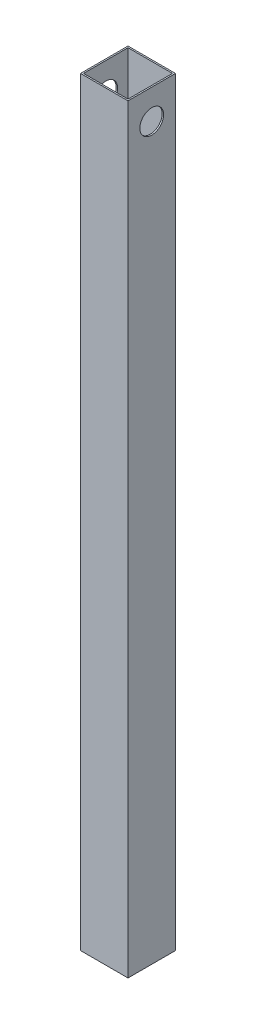
ISO-10303-21;
HEADER;
FILE_DESCRIPTION(('STEP AP214'),'2;1');
FILE_NAME('part.step','',(''),(''),'','','');
FILE_SCHEMA(('AUTOMOTIVE_DESIGN { 1 0 10303 214 1 1 1 1 }'));
ENDSEC;
DATA;
#1=APPLICATION_CONTEXT('core data for automotive mechanical design processes');
#2=APPLICATION_PROTOCOL_DEFINITION('international standard','automotive_design',2000,#1);
#3=PRODUCT_CONTEXT('',#1,'mechanical');
#4=PRODUCT('Part','Part','',(#3));
#5=PRODUCT_RELATED_PRODUCT_CATEGORY('part','',(#4));
#6=PRODUCT_DEFINITION_FORMATION('','',#4);
#7=PRODUCT_DEFINITION_CONTEXT('part definition',#1,'design');
#8=PRODUCT_DEFINITION('design','',#6,#7);
#9=PRODUCT_DEFINITION_SHAPE('','',#8);
#10=(LENGTH_UNIT() NAMED_UNIT(*) SI_UNIT(.MILLI.,.METRE.));
#11=(NAMED_UNIT(*) PLANE_ANGLE_UNIT() SI_UNIT($,.RADIAN.));
#12=(NAMED_UNIT(*) SI_UNIT($,.STERADIAN.) SOLID_ANGLE_UNIT());
#13=UNCERTAINTY_MEASURE_WITH_UNIT(LENGTH_MEASURE(1.E-05),#10,'distance_accuracy_value','');
#14=(GEOMETRIC_REPRESENTATION_CONTEXT(3) GLOBAL_UNCERTAINTY_ASSIGNED_CONTEXT((#13)) GLOBAL_UNIT_ASSIGNED_CONTEXT((#10,
#11,#12)) REPRESENTATION_CONTEXT('',''));
#15=CARTESIAN_POINT('',(0.,0.,0.));
#16=DIRECTION('',(0.,0.,1.));
#17=DIRECTION('',(1.,0.,0.));
#18=AXIS2_PLACEMENT_3D('',#15,#16,#17);
#19=CARTESIAN_POINT('',(0.,406.4,0.));
#20=DIRECTION('',(0.,-1.,0.));
#21=DIRECTION('',(0.,0.,-1.));
#22=AXIS2_PLACEMENT_3D('',#19,#20,#21);
#23=PLANE('',#22);
#24=DIRECTION('',(0.,0.,1.));
#25=VECTOR('',#24,1.);
#26=CARTESIAN_POINT('',(0.,406.4,0.));
#27=LINE('',#26,#25);
#28=CARTESIAN_POINT('',(0.,406.4,-50.8));
#29=VERTEX_POINT('',#28);
#30=CARTESIAN_POINT('',(0.,406.4,0.));
#31=VERTEX_POINT('',#30);
#32=EDGE_CURVE('E143',#29,#31,#27,.T.);
#33=ORIENTED_EDGE('',*,*,#32,.T.);
#34=DIRECTION('',(1.,0.,0.));
#35=VECTOR('',#34,1.);
#36=CARTESIAN_POINT('',(0.,406.4,0.));
#37=LINE('',#36,#35);
#38=CARTESIAN_POINT('',(50.8,406.4,0.));
#39=VERTEX_POINT('',#38);
#40=EDGE_CURVE('E146',#31,#39,#37,.T.);
#41=ORIENTED_EDGE('',*,*,#40,.T.);
#42=DIRECTION('',(0.,0.,-1.));
#43=VECTOR('',#42,1.);
#44=CARTESIAN_POINT('',(50.8,406.4,0.));
#45=LINE('',#44,#43);
#46=CARTESIAN_POINT('',(50.8,406.4,-50.8));
#47=VERTEX_POINT('',#46);
#48=EDGE_CURVE('E149',#39,#47,#45,.T.);
#49=ORIENTED_EDGE('',*,*,#48,.T.);
#50=DIRECTION('',(-1.,0.,0.));
#51=VECTOR('',#50,1.);
#52=CARTESIAN_POINT('',(0.,406.4,-50.8));
#53=LINE('',#52,#51);
#54=EDGE_CURVE('E150',#47,#29,#53,.T.);
#55=ORIENTED_EDGE('',*,*,#54,.T.);
#56=EDGE_LOOP('',(#33,#41,#49,#55));
#57=FACE_BOUND('',#56,.T.);
#58=DIRECTION('',(0.,0.,1.));
#59=VECTOR('',#58,1.);
#60=CARTESIAN_POINT('',(1.5875,406.4,0.));
#61=LINE('',#60,#59);
#62=CARTESIAN_POINT('',(1.5875,406.4,-49.2125));
#63=VERTEX_POINT('',#62);
#64=CARTESIAN_POINT('',(1.5875,406.4,-1.5875));
#65=VERTEX_POINT('',#64);
#66=EDGE_CURVE('E131',#63,#65,#61,.T.);
#67=ORIENTED_EDGE('',*,*,#66,.F.);
#68=DIRECTION('',(-1.,0.,0.));
#69=VECTOR('',#68,1.);
#70=CARTESIAN_POINT('',(0.,406.4,-49.2125));
#71=LINE('',#70,#69);
#72=CARTESIAN_POINT('',(49.2125,406.4,-49.2125));
#73=VERTEX_POINT('',#72);
#74=EDGE_CURVE('E115',#73,#63,#71,.T.);
#75=ORIENTED_EDGE('',*,*,#74,.F.);
#76=DIRECTION('',(0.,0.,-1.));
#77=VECTOR('',#76,1.);
#78=CARTESIAN_POINT('',(49.2125,406.4,0.));
#79=LINE('',#78,#77);
#80=CARTESIAN_POINT('',(49.2125,406.4,-1.5875));
#81=VERTEX_POINT('',#80);
#82=EDGE_CURVE('E140',#81,#73,#79,.T.);
#83=ORIENTED_EDGE('',*,*,#82,.F.);
#84=DIRECTION('',(1.,0.,0.));
#85=VECTOR('',#84,1.);
#86=CARTESIAN_POINT('',(0.,406.4,-1.5875));
#87=LINE('',#86,#85);
#88=EDGE_CURVE('E133',#65,#81,#87,.T.);
#89=ORIENTED_EDGE('',*,*,#88,.F.);
#90=EDGE_LOOP('',(#67,#75,#83,#89));
#91=FACE_BOUND('',#90,.T.);
#92=ADVANCED_FACE('F44',(#57,#91),#23,.F.);
#93=CARTESIAN_POINT('',(0.,-406.4,0.));
#94=DIRECTION('',(0.,-1.,0.));
#95=DIRECTION('',(0.,0.,-1.));
#96=AXIS2_PLACEMENT_3D('',#93,#94,#95);
#97=PLANE('',#96);
#98=DIRECTION('',(0.,0.,1.));
#99=VECTOR('',#98,1.);
#100=CARTESIAN_POINT('',(0.,-406.4,0.));
#101=LINE('',#100,#99);
#102=CARTESIAN_POINT('',(0.,-406.4,-50.8));
#103=VERTEX_POINT('',#102);
#104=CARTESIAN_POINT('',(0.,-406.4,0.));
#105=VERTEX_POINT('',#104);
#106=EDGE_CURVE('E154',#103,#105,#101,.T.);
#107=ORIENTED_EDGE('',*,*,#106,.F.);
#108=DIRECTION('',(-1.,0.,0.));
#109=VECTOR('',#108,1.);
#110=CARTESIAN_POINT('',(0.,-406.4,-50.8));
#111=LINE('',#110,#109);
#112=CARTESIAN_POINT('',(50.8,-406.4,-50.8));
#113=VERTEX_POINT('',#112);
#114=EDGE_CURVE('E147',#113,#103,#111,.T.);
#115=ORIENTED_EDGE('',*,*,#114,.F.);
#116=DIRECTION('',(0.,0.,-1.));
#117=VECTOR('',#116,1.);
#118=CARTESIAN_POINT('',(50.8,-406.4,0.));
#119=LINE('',#118,#117);
#120=CARTESIAN_POINT('',(50.8,-406.4,0.));
#121=VERTEX_POINT('',#120);
#122=EDGE_CURVE('E159',#121,#113,#119,.T.);
#123=ORIENTED_EDGE('',*,*,#122,.F.);
#124=DIRECTION('',(1.,0.,0.));
#125=VECTOR('',#124,1.);
#126=CARTESIAN_POINT('',(0.,-406.4,0.));
#127=LINE('',#126,#125);
#128=EDGE_CURVE('E157',#105,#121,#127,.T.);
#129=ORIENTED_EDGE('',*,*,#128,.F.);
#130=EDGE_LOOP('',(#107,#115,#123,#129));
#131=FACE_BOUND('',#130,.T.);
#132=DIRECTION('',(-1.,0.,0.));
#133=VECTOR('',#132,1.);
#134=CARTESIAN_POINT('',(0.,-406.4,-49.2125));
#135=LINE('',#134,#133);
#136=CARTESIAN_POINT('',(49.2125,-406.4,-49.2125));
#137=VERTEX_POINT('',#136);
#138=CARTESIAN_POINT('',(1.5875,-406.4,-49.2125));
#139=VERTEX_POINT('',#138);
#140=EDGE_CURVE('E113',#137,#139,#135,.T.);
#141=ORIENTED_EDGE('',*,*,#140,.T.);
#142=DIRECTION('',(0.,0.,1.));
#143=VECTOR('',#142,1.);
#144=CARTESIAN_POINT('',(1.5875,-406.4,0.));
#145=LINE('',#144,#143);
#146=CARTESIAN_POINT('',(1.5875,-406.4,-1.5875));
#147=VERTEX_POINT('',#146);
#148=EDGE_CURVE('E121',#139,#147,#145,.T.);
#149=ORIENTED_EDGE('',*,*,#148,.T.);
#150=DIRECTION('',(1.,0.,0.));
#151=VECTOR('',#150,1.);
#152=CARTESIAN_POINT('',(0.,-406.4,-1.5875));
#153=LINE('',#152,#151);
#154=CARTESIAN_POINT('',(49.2125,-406.4,-1.5875));
#155=VERTEX_POINT('',#154);
#156=EDGE_CURVE('E127',#147,#155,#153,.T.);
#157=ORIENTED_EDGE('',*,*,#156,.T.);
#158=DIRECTION('',(0.,0.,-1.));
#159=VECTOR('',#158,1.);
#160=CARTESIAN_POINT('',(49.2125,-406.4,0.));
#161=LINE('',#160,#159);
#162=EDGE_CURVE('E67',#155,#137,#161,.T.);
#163=ORIENTED_EDGE('',*,*,#162,.T.);
#164=EDGE_LOOP('',(#141,#149,#157,#163));
#165=FACE_BOUND('',#164,.T.);
#166=ADVANCED_FACE('F130',(#131,#165),#97,.T.);
#167=CARTESIAN_POINT('',(0.,406.4,0.));
#168=DIRECTION('',(1.,0.,0.));
#169=DIRECTION('',(0.,0.,-1.));
#170=AXIS2_PLACEMENT_3D('',#167,#168,#169);
#171=PLANE('',#170);
#172=CARTESIAN_POINT('',(0.,374.65,-25.4));
#173=DIRECTION('',(1.,0.,0.));
#174=DIRECTION('',(0.,0.,-1.));
#175=AXIS2_PLACEMENT_3D('',#172,#173,#174);
#176=CIRCLE('',#175,12.7);
#177=CARTESIAN_POINT('',(0.,374.65,-38.1));
#178=VERTEX_POINT('',#177);
#179=EDGE_CURVE('E232',#178,#178,#176,.T.);
#180=ORIENTED_EDGE('',*,*,#179,.T.);
#181=EDGE_LOOP('',(#180));
#182=FACE_BOUND('',#181,.T.);
#183=ORIENTED_EDGE('',*,*,#106,.T.);
#184=DIRECTION('',(0.,-1.,0.));
#185=VECTOR('',#184,1.);
#186=CARTESIAN_POINT('',(0.,406.4,0.));
#187=LINE('',#186,#185);
#188=EDGE_CURVE('E12',#31,#105,#187,.T.);
#189=ORIENTED_EDGE('',*,*,#188,.F.);
#190=ORIENTED_EDGE('',*,*,#32,.F.);
#191=DIRECTION('',(0.,-1.,0.));
#192=VECTOR('',#191,1.);
#193=CARTESIAN_POINT('',(0.,406.4,-50.8));
#194=LINE('',#193,#192);
#195=EDGE_CURVE('E153',#29,#103,#194,.T.);
#196=ORIENTED_EDGE('',*,*,#195,.T.);
#197=EDGE_LOOP('',(#183,#189,#190,#196));
#198=FACE_BOUND('',#197,.T.);
#199=ADVANCED_FACE('F46',(#182,#198),#171,.F.);
#200=CARTESIAN_POINT('',(0.,406.4,0.));
#201=DIRECTION('',(0.,0.,-1.));
#202=DIRECTION('',(-1.,0.,0.));
#203=AXIS2_PLACEMENT_3D('',#200,#201,#202);
#204=PLANE('',#203);
#205=ORIENTED_EDGE('',*,*,#128,.T.);
#206=DIRECTION('',(0.,-1.,0.));
#207=VECTOR('',#206,1.);
#208=CARTESIAN_POINT('',(50.8,406.4,0.));
#209=LINE('',#208,#207);
#210=EDGE_CURVE('E53',#39,#121,#209,.T.);
#211=ORIENTED_EDGE('',*,*,#210,.F.);
#212=ORIENTED_EDGE('',*,*,#40,.F.);
#213=ORIENTED_EDGE('',*,*,#188,.T.);
#214=EDGE_LOOP('',(#205,#211,#212,#213));
#215=FACE_BOUND('',#214,.T.);
#216=ADVANCED_FACE('F187',(#215),#204,.F.);
#217=CARTESIAN_POINT('',(50.8,406.4,0.));
#218=DIRECTION('',(-1.,0.,0.));
#219=DIRECTION('',(0.,0.,1.));
#220=AXIS2_PLACEMENT_3D('',#217,#218,#219);
#221=PLANE('',#220);
#222=CARTESIAN_POINT('',(50.8,374.65,-25.4));
#223=DIRECTION('',(1.,0.,0.));
#224=DIRECTION('',(0.,0.,-1.));
#225=AXIS2_PLACEMENT_3D('',#222,#223,#224);
#226=CIRCLE('',#225,12.7);
#227=CARTESIAN_POINT('',(50.8,374.65,-38.1));
#228=VERTEX_POINT('',#227);
#229=EDGE_CURVE('E236',#228,#228,#226,.T.);
#230=ORIENTED_EDGE('',*,*,#229,.F.);
#231=EDGE_LOOP('',(#230));
#232=FACE_BOUND('',#231,.T.);
#233=ORIENTED_EDGE('',*,*,#122,.T.);
#234=DIRECTION('',(0.,-1.,0.));
#235=VECTOR('',#234,1.);
#236=CARTESIAN_POINT('',(50.8,406.4,-50.8));
#237=LINE('',#236,#235);
#238=EDGE_CURVE('E164',#47,#113,#237,.T.);
#239=ORIENTED_EDGE('',*,*,#238,.F.);
#240=ORIENTED_EDGE('',*,*,#48,.F.);
#241=ORIENTED_EDGE('',*,*,#210,.T.);
#242=EDGE_LOOP('',(#233,#239,#240,#241));
#243=FACE_BOUND('',#242,.T.);
#244=ADVANCED_FACE('F172',(#232,#243),#221,.F.);
#245=CARTESIAN_POINT('',(0.,406.4,-50.8));
#246=DIRECTION('',(0.,0.,1.));
#247=DIRECTION('',(1.,0.,0.));
#248=AXIS2_PLACEMENT_3D('',#245,#246,#247);
#249=PLANE('',#248);
#250=ORIENTED_EDGE('',*,*,#114,.T.);
#251=ORIENTED_EDGE('',*,*,#195,.F.);
#252=ORIENTED_EDGE('',*,*,#54,.F.);
#253=ORIENTED_EDGE('',*,*,#238,.T.);
#254=EDGE_LOOP('',(#250,#251,#252,#253));
#255=FACE_BOUND('',#254,.T.);
#256=ADVANCED_FACE('F180',(#255),#249,.F.);
#257=CARTESIAN_POINT('',(1.5875,406.4,0.));
#258=DIRECTION('',(1.,0.,0.));
#259=DIRECTION('',(0.,0.,-1.));
#260=AXIS2_PLACEMENT_3D('',#257,#258,#259);
#261=PLANE('',#260);
#262=CARTESIAN_POINT('',(1.5875,374.65,-25.4));
#263=DIRECTION('',(1.,0.,0.));
#264=DIRECTION('',(0.,0.,-1.));
#265=AXIS2_PLACEMENT_3D('',#262,#263,#264);
#266=CIRCLE('',#265,12.7);
#267=CARTESIAN_POINT('',(1.5875,374.65,-38.1));
#268=VERTEX_POINT('',#267);
#269=EDGE_CURVE('E128',#268,#268,#266,.T.);
#270=ORIENTED_EDGE('',*,*,#269,.F.);
#271=EDGE_LOOP('',(#270));
#272=FACE_BOUND('',#271,.T.);
#273=ORIENTED_EDGE('',*,*,#148,.F.);
#274=DIRECTION('',(0.,-1.,0.));
#275=VECTOR('',#274,1.);
#276=CARTESIAN_POINT('',(1.5875,406.4,-49.2125));
#277=LINE('',#276,#275);
#278=EDGE_CURVE('E109',#63,#139,#277,.T.);
#279=ORIENTED_EDGE('',*,*,#278,.F.);
#280=ORIENTED_EDGE('',*,*,#66,.T.);
#281=DIRECTION('',(0.,-1.,0.));
#282=VECTOR('',#281,1.);
#283=CARTESIAN_POINT('',(1.5875,406.4,-1.5875));
#284=LINE('',#283,#282);
#285=EDGE_CURVE('E124',#65,#147,#284,.T.);
#286=ORIENTED_EDGE('',*,*,#285,.T.);
#287=EDGE_LOOP('',(#273,#279,#280,#286));
#288=FACE_BOUND('',#287,.T.);
#289=ADVANCED_FACE('F122',(#272,#288),#261,.T.);
#290=CARTESIAN_POINT('',(0.,406.4,-1.5875));
#291=DIRECTION('',(0.,0.,-1.));
#292=DIRECTION('',(-1.,0.,0.));
#293=AXIS2_PLACEMENT_3D('',#290,#291,#292);
#294=PLANE('',#293);
#295=ORIENTED_EDGE('',*,*,#156,.F.);
#296=ORIENTED_EDGE('',*,*,#285,.F.);
#297=ORIENTED_EDGE('',*,*,#88,.T.);
#298=DIRECTION('',(0.,-1.,0.));
#299=VECTOR('',#298,1.);
#300=CARTESIAN_POINT('',(49.2125,406.4,-1.5875));
#301=LINE('',#300,#299);
#302=EDGE_CURVE('E242',#81,#155,#301,.T.);
#303=ORIENTED_EDGE('',*,*,#302,.T.);
#304=EDGE_LOOP('',(#295,#296,#297,#303));
#305=FACE_BOUND('',#304,.T.);
#306=ADVANCED_FACE('F212',(#305),#294,.T.);
#307=CARTESIAN_POINT('',(49.2125,406.4,0.));
#308=DIRECTION('',(-1.,0.,0.));
#309=DIRECTION('',(0.,0.,1.));
#310=AXIS2_PLACEMENT_3D('',#307,#308,#309);
#311=PLANE('',#310);
#312=CARTESIAN_POINT('',(49.2125,374.65,-25.4));
#313=DIRECTION('',(-1.,0.,0.));
#314=DIRECTION('',(0.,0.,1.));
#315=AXIS2_PLACEMENT_3D('',#312,#313,#314);
#316=CIRCLE('',#315,12.7);
#317=CARTESIAN_POINT('',(49.2125,374.65,-12.7));
#318=VERTEX_POINT('',#317);
#319=EDGE_CURVE('E48',#318,#318,#316,.T.);
#320=ORIENTED_EDGE('',*,*,#319,.F.);
#321=EDGE_LOOP('',(#320));
#322=FACE_BOUND('',#321,.T.);
#323=ORIENTED_EDGE('',*,*,#162,.F.);
#324=ORIENTED_EDGE('',*,*,#302,.F.);
#325=ORIENTED_EDGE('',*,*,#82,.T.);
#326=DIRECTION('',(0.,-1.,0.));
#327=VECTOR('',#326,1.);
#328=CARTESIAN_POINT('',(49.2125,406.4,-49.2125));
#329=LINE('',#328,#327);
#330=EDGE_CURVE('E60',#73,#137,#329,.T.);
#331=ORIENTED_EDGE('',*,*,#330,.T.);
#332=EDGE_LOOP('',(#323,#324,#325,#331));
#333=FACE_BOUND('',#332,.T.);
#334=ADVANCED_FACE('F218',(#322,#333),#311,.T.);
#335=CARTESIAN_POINT('',(0.,406.4,-49.2125));
#336=DIRECTION('',(0.,0.,1.));
#337=DIRECTION('',(1.,0.,0.));
#338=AXIS2_PLACEMENT_3D('',#335,#336,#337);
#339=PLANE('',#338);
#340=ORIENTED_EDGE('',*,*,#140,.F.);
#341=ORIENTED_EDGE('',*,*,#330,.F.);
#342=ORIENTED_EDGE('',*,*,#74,.T.);
#343=ORIENTED_EDGE('',*,*,#278,.T.);
#344=EDGE_LOOP('',(#340,#341,#342,#343));
#345=FACE_BOUND('',#344,.T.);
#346=ADVANCED_FACE('F111',(#345),#339,.T.);
#347=CARTESIAN_POINT('',(0.,374.65,-25.4));
#348=DIRECTION('',(1.,0.,0.));
#349=DIRECTION('',(0.,0.,-1.));
#350=AXIS2_PLACEMENT_3D('',#347,#348,#349);
#351=CYLINDRICAL_SURFACE('',#350,12.7);
#352=ORIENTED_EDGE('',*,*,#319,.T.);
#353=EDGE_LOOP('',(#352));
#354=FACE_BOUND('',#353,.T.);
#355=ORIENTED_EDGE('',*,*,#229,.T.);
#356=EDGE_LOOP('',(#355));
#357=FACE_BOUND('',#356,.T.);
#358=ADVANCED_FACE('F223',(#354,#357),#351,.F.);
#359=ORIENTED_EDGE('',*,*,#269,.T.);
#360=EDGE_LOOP('',(#359));
#361=FACE_BOUND('',#360,.T.);
#362=ORIENTED_EDGE('',*,*,#179,.F.);
#363=EDGE_LOOP('',(#362));
#364=FACE_BOUND('',#363,.T.);
#365=ADVANCED_FACE('F249',(#361,#364),#351,.F.);
#366=CLOSED_SHELL('',(#92,#166,#199,#216,#244,#256,#289,#306,#334,#346,#358,#365));
#367=MANIFOLD_SOLID_BREP('B2',#366);
#368=ADVANCED_BREP_SHAPE_REPRESENTATION('',(#18,#367),#14);
#369=SHAPE_DEFINITION_REPRESENTATION(#9,#368);
ENDSEC;
END-ISO-10303-21;
